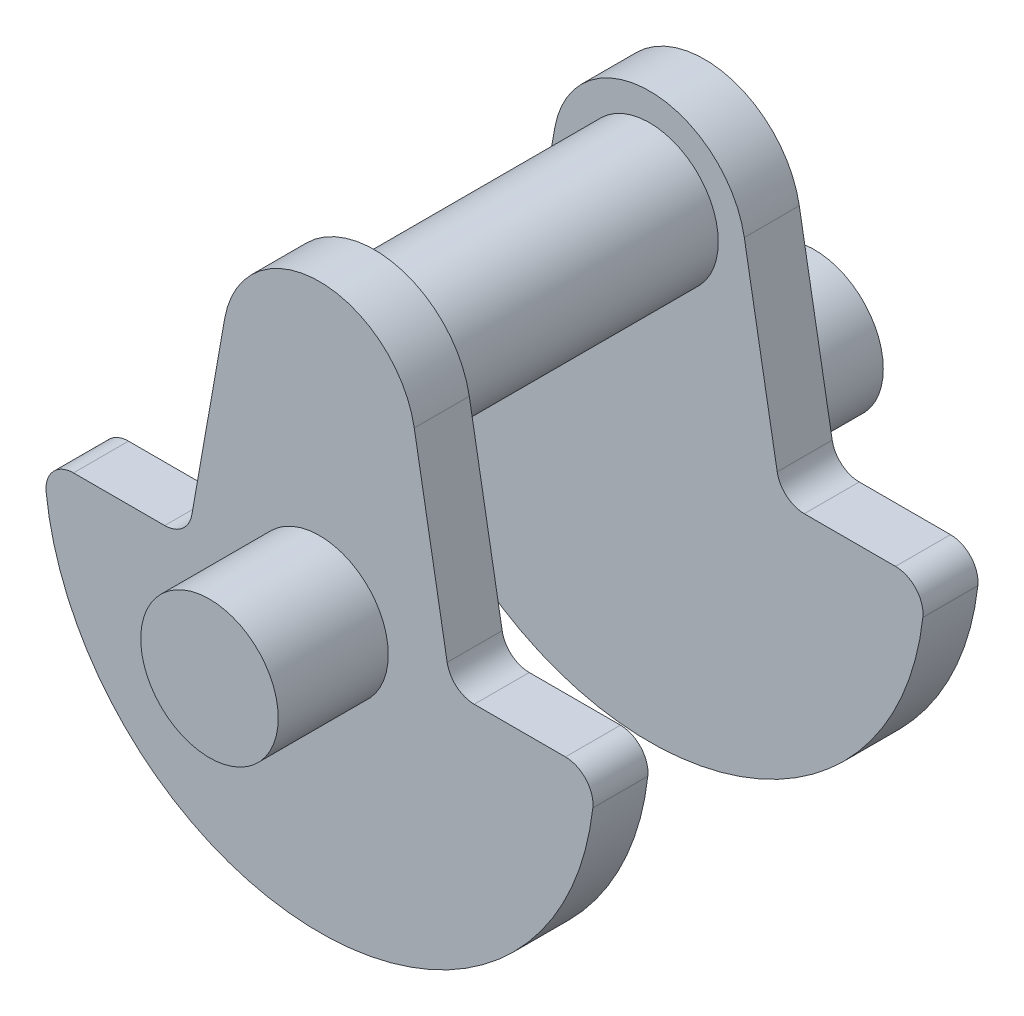
ISO-10303-21;
HEADER;
FILE_DESCRIPTION(('STEP AP214'),'2;1');
FILE_NAME('part.step','',(''),(''),'','','');
FILE_SCHEMA(('AUTOMOTIVE_DESIGN { 1 0 10303 214 1 1 1 1 }'));
ENDSEC;
DATA;
#1=APPLICATION_CONTEXT('core data for automotive mechanical design processes');
#2=APPLICATION_PROTOCOL_DEFINITION('international standard','automotive_design',2000,#1);
#3=PRODUCT_CONTEXT('',#1,'mechanical');
#4=PRODUCT('Part','Part','',(#3));
#5=PRODUCT_RELATED_PRODUCT_CATEGORY('part','',(#4));
#6=PRODUCT_DEFINITION_FORMATION('','',#4);
#7=PRODUCT_DEFINITION_CONTEXT('part definition',#1,'design');
#8=PRODUCT_DEFINITION('design','',#6,#7);
#9=PRODUCT_DEFINITION_SHAPE('','',#8);
#10=(LENGTH_UNIT() NAMED_UNIT(*) SI_UNIT(.MILLI.,.METRE.));
#11=(NAMED_UNIT(*) PLANE_ANGLE_UNIT() SI_UNIT($,.RADIAN.));
#12=(NAMED_UNIT(*) SI_UNIT($,.STERADIAN.) SOLID_ANGLE_UNIT());
#13=UNCERTAINTY_MEASURE_WITH_UNIT(LENGTH_MEASURE(1.E-05),#10,'distance_accuracy_value','');
#14=(GEOMETRIC_REPRESENTATION_CONTEXT(3) GLOBAL_UNCERTAINTY_ASSIGNED_CONTEXT((#13)) GLOBAL_UNIT_ASSIGNED_CONTEXT((#10,
#11,#12)) REPRESENTATION_CONTEXT('',''));
#15=CARTESIAN_POINT('',(0.,0.,0.));
#16=DIRECTION('',(0.,0.,1.));
#17=DIRECTION('',(1.,0.,0.));
#18=AXIS2_PLACEMENT_3D('',#15,#16,#17);
#19=CARTESIAN_POINT('',(-44.7213595499958,-40.,10.));
#20=DIRECTION('',(0.,0.,-1.));
#21=DIRECTION('',(-1.,0.,0.));
#22=AXIS2_PLACEMENT_3D('',#19,#20,#21);
#23=CYLINDRICAL_SURFACE('',#22,4.99999999999999);
#24=CARTESIAN_POINT('',(-44.7213595499958,-40.,0.));
#25=DIRECTION('',(0.,0.,1.));
#26=DIRECTION('',(1.,0.,0.));
#27=AXIS2_PLACEMENT_3D('',#24,#25,#26);
#28=CIRCLE('',#27,4.99999999999999);
#29=CARTESIAN_POINT('',(-44.7213595499958,-35.,0.));
#30=VERTEX_POINT('',#29);
#31=CARTESIAN_POINT('',(-49.6903994999953,-40.5555555555555,0.));
#32=VERTEX_POINT('',#31);
#33=EDGE_CURVE('E159',#30,#32,#28,.T.);
#34=ORIENTED_EDGE('',*,*,#33,.T.);
#35=DIRECTION('',(0.,0.,-1.));
#36=VECTOR('',#35,1.);
#37=CARTESIAN_POINT('',(-49.6903994999953,-40.5555555555555,10.));
#38=LINE('',#37,#36);
#39=CARTESIAN_POINT('',(-49.6903994999953,-40.5555555555555,10.));
#40=VERTEX_POINT('',#39);
#41=EDGE_CURVE('E50',#40,#32,#38,.T.);
#42=ORIENTED_EDGE('',*,*,#41,.F.);
#43=CARTESIAN_POINT('',(-44.7213595499958,-40.,10.));
#44=DIRECTION('',(0.,0.,1.));
#45=DIRECTION('',(1.,0.,0.));
#46=AXIS2_PLACEMENT_3D('',#43,#44,#45);
#47=CIRCLE('',#46,4.99999999999999);
#48=CARTESIAN_POINT('',(-44.7213595499958,-35.,10.));
#49=VERTEX_POINT('',#48);
#50=EDGE_CURVE('E188',#49,#40,#47,.T.);
#51=ORIENTED_EDGE('',*,*,#50,.F.);
#52=DIRECTION('',(0.,0.,-1.));
#53=VECTOR('',#52,1.);
#54=CARTESIAN_POINT('',(-44.7213595499958,-35.,10.));
#55=LINE('',#54,#53);
#56=EDGE_CURVE('E155',#49,#30,#55,.T.);
#57=ORIENTED_EDGE('',*,*,#56,.T.);
#58=EDGE_LOOP('',(#34,#42,#51,#57));
#59=FACE_BOUND('',#58,.T.);
#60=ADVANCED_FACE('F41',(#59),#23,.T.);
#61=CARTESIAN_POINT('',(0.,-35.,10.));
#62=DIRECTION('',(0.,0.,-1.));
#63=DIRECTION('',(-1.,0.,0.));
#64=AXIS2_PLACEMENT_3D('',#61,#62,#63);
#65=CYLINDRICAL_SURFACE('',#64,50.);
#66=CARTESIAN_POINT('',(0.,-35.,0.));
#67=DIRECTION('',(0.,0.,1.));
#68=DIRECTION('',(1.,0.,0.));
#69=AXIS2_PLACEMENT_3D('',#66,#67,#68);
#70=CIRCLE('',#69,50.);
#71=CARTESIAN_POINT('',(49.6903994999953,-40.5555555555556,0.));
#72=VERTEX_POINT('',#71);
#73=EDGE_CURVE('E163',#32,#72,#70,.T.);
#74=ORIENTED_EDGE('',*,*,#73,.T.);
#75=DIRECTION('',(0.,0.,-1.));
#76=VECTOR('',#75,1.);
#77=CARTESIAN_POINT('',(49.6903994999953,-40.5555555555556,10.));
#78=LINE('',#77,#76);
#79=CARTESIAN_POINT('',(49.6903994999953,-40.5555555555556,10.));
#80=VERTEX_POINT('',#79);
#81=EDGE_CURVE('E211',#80,#72,#78,.T.);
#82=ORIENTED_EDGE('',*,*,#81,.F.);
#83=CARTESIAN_POINT('',(0.,-35.,10.));
#84=DIRECTION('',(0.,0.,1.));
#85=DIRECTION('',(1.,0.,0.));
#86=AXIS2_PLACEMENT_3D('',#83,#84,#85);
#87=CIRCLE('',#86,50.);
#88=EDGE_CURVE('E109',#40,#80,#87,.T.);
#89=ORIENTED_EDGE('',*,*,#88,.F.);
#90=ORIENTED_EDGE('',*,*,#41,.T.);
#91=EDGE_LOOP('',(#74,#82,#89,#90));
#92=FACE_BOUND('',#91,.T.);
#93=ADVANCED_FACE('F216',(#92),#65,.T.);
#94=CARTESIAN_POINT('',(44.7213595499958,-40.,10.));
#95=DIRECTION('',(0.,0.,-1.));
#96=DIRECTION('',(-1.,0.,0.));
#97=AXIS2_PLACEMENT_3D('',#94,#95,#96);
#98=CYLINDRICAL_SURFACE('',#97,4.99999999999999);
#99=CARTESIAN_POINT('',(44.7213595499958,-40.,0.));
#100=DIRECTION('',(0.,0.,1.));
#101=DIRECTION('',(-1.,0.,0.));
#102=AXIS2_PLACEMENT_3D('',#99,#100,#101);
#103=CIRCLE('',#102,4.99999999999999);
#104=CARTESIAN_POINT('',(44.7213595499958,-35.,0.));
#105=VERTEX_POINT('',#104);
#106=EDGE_CURVE('E167',#72,#105,#103,.T.);
#107=ORIENTED_EDGE('',*,*,#106,.T.);
#108=DIRECTION('',(0.,0.,-1.));
#109=VECTOR('',#108,1.);
#110=CARTESIAN_POINT('',(44.7213595499958,-35.,10.));
#111=LINE('',#110,#109);
#112=CARTESIAN_POINT('',(44.7213595499958,-35.,10.));
#113=VERTEX_POINT('',#112);
#114=EDGE_CURVE('E207',#113,#105,#111,.T.);
#115=ORIENTED_EDGE('',*,*,#114,.F.);
#116=CARTESIAN_POINT('',(44.7213595499958,-40.,10.));
#117=DIRECTION('',(0.,0.,1.));
#118=DIRECTION('',(-1.,0.,0.));
#119=AXIS2_PLACEMENT_3D('',#116,#117,#118);
#120=CIRCLE('',#119,4.99999999999999);
#121=EDGE_CURVE('E237',#80,#113,#120,.T.);
#122=ORIENTED_EDGE('',*,*,#121,.F.);
#123=ORIENTED_EDGE('',*,*,#81,.T.);
#124=EDGE_LOOP('',(#107,#115,#122,#123));
#125=FACE_BOUND('',#124,.T.);
#126=ADVANCED_FACE('F227',(#125),#98,.T.);
#127=CARTESIAN_POINT('',(28.1369081886833,-35.,10.));
#128=DIRECTION('',(0.,-1.,0.));
#129=DIRECTION('',(0.,0.,-1.));
#130=AXIS2_PLACEMENT_3D('',#127,#128,#129);
#131=PLANE('',#130);
#132=DIRECTION('',(-1.,0.,0.));
#133=VECTOR('',#132,1.);
#134=CARTESIAN_POINT('',(28.1369081886833,-35.,0.));
#135=LINE('',#134,#133);
#136=CARTESIAN_POINT('',(28.1369081886833,-35.,0.));
#137=VERTEX_POINT('',#136);
#138=EDGE_CURVE('E170',#105,#137,#135,.T.);
#139=ORIENTED_EDGE('',*,*,#138,.T.);
#140=DIRECTION('',(0.,0.,-1.));
#141=VECTOR('',#140,1.);
#142=CARTESIAN_POINT('',(28.1369081886833,-35.,10.));
#143=LINE('',#142,#141);
#144=CARTESIAN_POINT('',(28.1369081886833,-35.,10.));
#145=VERTEX_POINT('',#144);
#146=EDGE_CURVE('E203',#145,#137,#143,.T.);
#147=ORIENTED_EDGE('',*,*,#146,.F.);
#148=DIRECTION('',(-1.,0.,0.));
#149=VECTOR('',#148,1.);
#150=CARTESIAN_POINT('',(28.1369081886833,-35.,10.));
#151=LINE('',#150,#149);
#152=EDGE_CURVE('E233',#113,#145,#151,.T.);
#153=ORIENTED_EDGE('',*,*,#152,.F.);
#154=ORIENTED_EDGE('',*,*,#114,.T.);
#155=EDGE_LOOP('',(#139,#147,#153,#154));
#156=FACE_BOUND('',#155,.T.);
#157=ADVANCED_FACE('F231',(#156),#131,.F.);
#158=CARTESIAN_POINT('',(28.1369081886832,-30.,10.));
#159=DIRECTION('',(0.,0.,-1.));
#160=DIRECTION('',(-1.,0.,0.));
#161=AXIS2_PLACEMENT_3D('',#158,#159,#160);
#162=CYLINDRICAL_SURFACE('',#161,5.);
#163=CARTESIAN_POINT('',(28.1369081886832,-30.,0.));
#164=DIRECTION('',(0.,0.,-1.));
#165=DIRECTION('',(1.,0.,0.));
#166=AXIS2_PLACEMENT_3D('',#163,#164,#165);
#167=CIRCLE('',#166,5.);
#168=CARTESIAN_POINT('',(23.2128694236222,-30.8682408883346,0.));
#169=VERTEX_POINT('',#168);
#170=EDGE_CURVE('E173',#137,#169,#167,.T.);
#171=ORIENTED_EDGE('',*,*,#170,.T.);
#172=DIRECTION('',(0.,0.,-1.));
#173=VECTOR('',#172,1.);
#174=CARTESIAN_POINT('',(23.2128694236222,-30.8682408883346,10.));
#175=LINE('',#174,#173);
#176=CARTESIAN_POINT('',(23.2128694236222,-30.8682408883346,10.));
#177=VERTEX_POINT('',#176);
#178=EDGE_CURVE('E199',#177,#169,#175,.T.);
#179=ORIENTED_EDGE('',*,*,#178,.F.);
#180=CARTESIAN_POINT('',(28.1369081886832,-30.,10.));
#181=DIRECTION('',(0.,0.,-1.));
#182=DIRECTION('',(1.,0.,0.));
#183=AXIS2_PLACEMENT_3D('',#180,#181,#182);
#184=CIRCLE('',#183,5.);
#185=EDGE_CURVE('E236',#145,#177,#184,.T.);
#186=ORIENTED_EDGE('',*,*,#185,.F.);
#187=ORIENTED_EDGE('',*,*,#146,.T.);
#188=EDGE_LOOP('',(#171,#179,#186,#187));
#189=FACE_BOUND('',#188,.T.);
#190=ADVANCED_FACE('F258',(#189),#162,.F.);
#191=CARTESIAN_POINT('',(17.2341356777136,3.03884310917129,10.));
#192=DIRECTION('',(-0.984807753012208,-0.173648177666931,0.));
#193=DIRECTION('',(0.173648177666931,-0.984807753012208,0.));
#194=AXIS2_PLACEMENT_3D('',#191,#192,#193);
#195=PLANE('',#194);
#196=DIRECTION('',(-0.173648177666931,0.984807753012208,0.));
#197=VECTOR('',#196,1.);
#198=CARTESIAN_POINT('',(17.2341356777136,3.03884310917129,0.));
#199=LINE('',#198,#197);
#200=CARTESIAN_POINT('',(17.2341356777136,3.03884310917129,0.));
#201=VERTEX_POINT('',#200);
#202=EDGE_CURVE('E176',#169,#201,#199,.T.);
#203=ORIENTED_EDGE('',*,*,#202,.T.);
#204=DIRECTION('',(0.,0.,-1.));
#205=VECTOR('',#204,1.);
#206=CARTESIAN_POINT('',(17.2341356777136,3.03884310917129,10.));
#207=LINE('',#206,#205);
#208=CARTESIAN_POINT('',(17.2341356777136,3.03884310917129,10.));
#209=VERTEX_POINT('',#208);
#210=EDGE_CURVE('E195',#209,#201,#207,.T.);
#211=ORIENTED_EDGE('',*,*,#210,.F.);
#212=DIRECTION('',(-0.173648177666931,0.984807753012208,0.));
#213=VECTOR('',#212,1.);
#214=CARTESIAN_POINT('',(17.2341356777136,3.03884310917129,10.));
#215=LINE('',#214,#213);
#216=EDGE_CURVE('E241',#177,#209,#215,.T.);
#217=ORIENTED_EDGE('',*,*,#216,.F.);
#218=ORIENTED_EDGE('',*,*,#178,.T.);
#219=EDGE_LOOP('',(#203,#211,#217,#218));
#220=FACE_BOUND('',#219,.T.);
#221=ADVANCED_FACE('F252',(#220),#195,.F.);
#222=CARTESIAN_POINT('',(0.,0.,10.));
#223=DIRECTION('',(0.,0.,-1.));
#224=DIRECTION('',(-1.,0.,0.));
#225=AXIS2_PLACEMENT_3D('',#222,#223,#224);
#226=CYLINDRICAL_SURFACE('',#225,17.5);
#227=CARTESIAN_POINT('',(0.,0.,0.));
#228=DIRECTION('',(0.,0.,1.));
#229=DIRECTION('',(1.,0.,0.));
#230=AXIS2_PLACEMENT_3D('',#227,#228,#229);
#231=CIRCLE('',#230,17.5);
#232=CARTESIAN_POINT('',(-17.2341356777136,3.03884310917129,0.));
#233=VERTEX_POINT('',#232);
#234=EDGE_CURVE('E179',#201,#233,#231,.T.);
#235=ORIENTED_EDGE('',*,*,#234,.T.);
#236=DIRECTION('',(0.,0.,-1.));
#237=VECTOR('',#236,1.);
#238=CARTESIAN_POINT('',(-17.2341356777136,3.03884310917129,10.));
#239=LINE('',#238,#237);
#240=CARTESIAN_POINT('',(-17.2341356777136,3.03884310917129,10.));
#241=VERTEX_POINT('',#240);
#242=EDGE_CURVE('E148',#241,#233,#239,.T.);
#243=ORIENTED_EDGE('',*,*,#242,.F.);
#244=CARTESIAN_POINT('',(0.,0.,10.));
#245=DIRECTION('',(0.,0.,1.));
#246=DIRECTION('',(1.,0.,0.));
#247=AXIS2_PLACEMENT_3D('',#244,#245,#246);
#248=CIRCLE('',#247,17.5);
#249=EDGE_CURVE('E137',#209,#241,#248,.T.);
#250=ORIENTED_EDGE('',*,*,#249,.F.);
#251=ORIENTED_EDGE('',*,*,#210,.T.);
#252=EDGE_LOOP('',(#235,#243,#250,#251));
#253=FACE_BOUND('',#252,.T.);
#254=ADVANCED_FACE('F256',(#253),#226,.T.);
#255=CARTESIAN_POINT('',(-17.2341356777136,3.03884310917129,10.));
#256=DIRECTION('',(0.984807753012208,-0.17364817766693,0.));
#257=DIRECTION('',(0.17364817766693,0.984807753012208,0.));
#258=AXIS2_PLACEMENT_3D('',#255,#256,#257);
#259=PLANE('',#258);
#260=DIRECTION('',(-0.173648177666931,-0.984807753012208,0.));
#261=VECTOR('',#260,1.);
#262=CARTESIAN_POINT('',(-17.2341356777136,3.03884310917129,0.));
#263=LINE('',#262,#261);
#264=CARTESIAN_POINT('',(-23.2128694236222,-30.8682408883346,0.));
#265=VERTEX_POINT('',#264);
#266=EDGE_CURVE('E146',#233,#265,#263,.T.);
#267=ORIENTED_EDGE('',*,*,#266,.T.);
#268=DIRECTION('',(0.,0.,-1.));
#269=VECTOR('',#268,1.);
#270=CARTESIAN_POINT('',(-23.2128694236222,-30.8682408883346,10.));
#271=LINE('',#270,#269);
#272=CARTESIAN_POINT('',(-23.2128694236222,-30.8682408883346,10.));
#273=VERTEX_POINT('',#272);
#274=EDGE_CURVE('E143',#273,#265,#271,.T.);
#275=ORIENTED_EDGE('',*,*,#274,.F.);
#276=DIRECTION('',(-0.173648177666931,-0.984807753012208,0.));
#277=VECTOR('',#276,1.);
#278=CARTESIAN_POINT('',(-17.2341356777136,3.03884310917129,10.));
#279=LINE('',#278,#277);
#280=EDGE_CURVE('E131',#241,#273,#279,.T.);
#281=ORIENTED_EDGE('',*,*,#280,.F.);
#282=ORIENTED_EDGE('',*,*,#242,.T.);
#283=EDGE_LOOP('',(#267,#275,#281,#282));
#284=FACE_BOUND('',#283,.T.);
#285=ADVANCED_FACE('F144',(#284),#259,.F.);
#286=CARTESIAN_POINT('',(-28.1369081886832,-30.,10.));
#287=DIRECTION('',(0.,0.,-1.));
#288=DIRECTION('',(-1.,0.,0.));
#289=AXIS2_PLACEMENT_3D('',#286,#287,#288);
#290=CYLINDRICAL_SURFACE('',#289,5.);
#291=CARTESIAN_POINT('',(-28.1369081886832,-30.,0.));
#292=DIRECTION('',(0.,0.,-1.));
#293=DIRECTION('',(-1.,0.,0.));
#294=AXIS2_PLACEMENT_3D('',#291,#292,#293);
#295=CIRCLE('',#294,5.);
#296=CARTESIAN_POINT('',(-28.1369081886832,-35.,0.));
#297=VERTEX_POINT('',#296);
#298=EDGE_CURVE('E94',#265,#297,#295,.T.);
#299=ORIENTED_EDGE('',*,*,#298,.T.);
#300=DIRECTION('',(0.,0.,-1.));
#301=VECTOR('',#300,1.);
#302=CARTESIAN_POINT('',(-28.1369081886832,-35.,10.));
#303=LINE('',#302,#301);
#304=CARTESIAN_POINT('',(-28.1369081886832,-35.,10.));
#305=VERTEX_POINT('',#304);
#306=EDGE_CURVE('E149',#305,#297,#303,.T.);
#307=ORIENTED_EDGE('',*,*,#306,.F.);
#308=CARTESIAN_POINT('',(-28.1369081886832,-30.,10.));
#309=DIRECTION('',(0.,0.,-1.));
#310=DIRECTION('',(-1.,0.,0.));
#311=AXIS2_PLACEMENT_3D('',#308,#309,#310);
#312=CIRCLE('',#311,5.);
#313=EDGE_CURVE('E135',#273,#305,#312,.T.);
#314=ORIENTED_EDGE('',*,*,#313,.F.);
#315=ORIENTED_EDGE('',*,*,#274,.T.);
#316=EDGE_LOOP('',(#299,#307,#314,#315));
#317=FACE_BOUND('',#316,.T.);
#318=ADVANCED_FACE('F151',(#317),#290,.F.);
#319=CARTESIAN_POINT('',(-44.7213595499958,-35.,10.));
#320=DIRECTION('',(0.,-1.,0.));
#321=DIRECTION('',(0.,0.,-1.));
#322=AXIS2_PLACEMENT_3D('',#319,#320,#321);
#323=PLANE('',#322);
#324=DIRECTION('',(-1.,0.,0.));
#325=VECTOR('',#324,1.);
#326=CARTESIAN_POINT('',(-44.7213595499958,-35.,0.));
#327=LINE('',#326,#325);
#328=EDGE_CURVE('E100',#297,#30,#327,.T.);
#329=ORIENTED_EDGE('',*,*,#328,.T.);
#330=ORIENTED_EDGE('',*,*,#56,.F.);
#331=DIRECTION('',(-1.,0.,0.));
#332=VECTOR('',#331,1.);
#333=CARTESIAN_POINT('',(-44.7213595499958,-35.,10.));
#334=LINE('',#333,#332);
#335=EDGE_CURVE('E58',#305,#49,#334,.T.);
#336=ORIENTED_EDGE('',*,*,#335,.F.);
#337=ORIENTED_EDGE('',*,*,#306,.T.);
#338=EDGE_LOOP('',(#329,#330,#336,#337));
#339=FACE_BOUND('',#338,.T.);
#340=ADVANCED_FACE('F318',(#339),#323,.F.);
#341=CARTESIAN_POINT('',(-44.7213595499958,-40.,10.));
#342=DIRECTION('',(0.,0.,1.));
#343=DIRECTION('',(1.,0.,0.));
#344=AXIS2_PLACEMENT_3D('',#341,#342,#343);
#345=PLANE('',#344);
#346=CARTESIAN_POINT('',(0.,-35.,10.));
#347=DIRECTION('',(0.,0.,1.));
#348=DIRECTION('',(1.,0.,0.));
#349=AXIS2_PLACEMENT_3D('',#346,#347,#348);
#350=CIRCLE('',#349,12.5);
#351=CARTESIAN_POINT('',(12.5,-35.,10.));
#352=VERTEX_POINT('',#351);
#353=EDGE_CURVE('E647',#352,#352,#350,.T.);
#354=ORIENTED_EDGE('',*,*,#353,.F.);
#355=EDGE_LOOP('',(#354));
#356=FACE_BOUND('',#355,.T.);
#357=ORIENTED_EDGE('',*,*,#50,.T.);
#358=ORIENTED_EDGE('',*,*,#88,.T.);
#359=ORIENTED_EDGE('',*,*,#121,.T.);
#360=ORIENTED_EDGE('',*,*,#152,.T.);
#361=ORIENTED_EDGE('',*,*,#185,.T.);
#362=ORIENTED_EDGE('',*,*,#216,.T.);
#363=ORIENTED_EDGE('',*,*,#249,.T.);
#364=ORIENTED_EDGE('',*,*,#280,.T.);
#365=ORIENTED_EDGE('',*,*,#313,.T.);
#366=ORIENTED_EDGE('',*,*,#335,.T.);
#367=EDGE_LOOP('',(#357,#358,#359,#360,#361,#362,#363,#364,#365,#366));
#368=FACE_BOUND('',#367,.T.);
#369=ADVANCED_FACE('F133',(#356,#368),#345,.T.);
#370=CARTESIAN_POINT('',(-44.7213595499958,-40.,0.));
#371=DIRECTION('',(0.,0.,1.));
#372=DIRECTION('',(1.,0.,0.));
#373=AXIS2_PLACEMENT_3D('',#370,#371,#372);
#374=PLANE('',#373);
#375=CARTESIAN_POINT('',(0.,0.,0.));
#376=DIRECTION('',(0.,0.,1.));
#377=DIRECTION('',(1.,0.,0.));
#378=AXIS2_PLACEMENT_3D('',#375,#376,#377);
#379=CIRCLE('',#378,12.5);
#380=CARTESIAN_POINT('',(12.5,0.,0.));
#381=VERTEX_POINT('',#380);
#382=EDGE_CURVE('E11',#381,#381,#379,.F.);
#383=ORIENTED_EDGE('',*,*,#382,.F.);
#384=EDGE_LOOP('',(#383));
#385=FACE_BOUND('',#384,.T.);
#386=ORIENTED_EDGE('',*,*,#33,.F.);
#387=ORIENTED_EDGE('',*,*,#328,.F.);
#388=ORIENTED_EDGE('',*,*,#298,.F.);
#389=ORIENTED_EDGE('',*,*,#266,.F.);
#390=ORIENTED_EDGE('',*,*,#234,.F.);
#391=ORIENTED_EDGE('',*,*,#202,.F.);
#392=ORIENTED_EDGE('',*,*,#170,.F.);
#393=ORIENTED_EDGE('',*,*,#138,.F.);
#394=ORIENTED_EDGE('',*,*,#106,.F.);
#395=ORIENTED_EDGE('',*,*,#73,.F.);
#396=EDGE_LOOP('',(#386,#387,#388,#389,#390,#391,#392,#393,#394,#395));
#397=FACE_BOUND('',#396,.T.);
#398=ADVANCED_FACE('F221',(#385,#397),#374,.F.);
#399=CARTESIAN_POINT('',(0.,-35.,30.));
#400=DIRECTION('',(0.,0.,-1.));
#401=DIRECTION('',(-1.,0.,0.));
#402=AXIS2_PLACEMENT_3D('',#399,#400,#401);
#403=CYLINDRICAL_SURFACE('',#402,12.5);
#404=CARTESIAN_POINT('',(0.,-35.,30.));
#405=DIRECTION('',(0.,0.,1.));
#406=DIRECTION('',(1.,0.,0.));
#407=AXIS2_PLACEMENT_3D('',#404,#405,#406);
#408=CIRCLE('',#407,12.5);
#409=CARTESIAN_POINT('',(12.5,-35.,30.));
#410=VERTEX_POINT('',#409);
#411=EDGE_CURVE('E164',#410,#410,#408,.T.);
#412=ORIENTED_EDGE('',*,*,#411,.F.);
#413=EDGE_LOOP('',(#412));
#414=FACE_BOUND('',#413,.T.);
#415=ORIENTED_EDGE('',*,*,#353,.T.);
#416=EDGE_LOOP('',(#415));
#417=FACE_BOUND('',#416,.T.);
#418=ADVANCED_FACE('F338',(#414,#417),#403,.T.);
#419=CARTESIAN_POINT('',(0.,-35.,30.));
#420=DIRECTION('',(0.,0.,1.));
#421=DIRECTION('',(1.,0.,0.));
#422=AXIS2_PLACEMENT_3D('',#419,#420,#421);
#423=PLANE('',#422);
#424=ORIENTED_EDGE('',*,*,#411,.T.);
#425=EDGE_LOOP('',(#424));
#426=FACE_BOUND('',#425,.T.);
#427=ADVANCED_FACE('F342',(#426),#423,.T.);
#428=CARTESIAN_POINT('',(0.,0.,-25.));
#429=DIRECTION('',(0.,0.,1.));
#430=DIRECTION('',(1.,0.,0.));
#431=AXIS2_PLACEMENT_3D('',#428,#429,#430);
#432=CYLINDRICAL_SURFACE('',#431,12.5);
#433=ORIENTED_EDGE('',*,*,#382,.T.);
#434=EDGE_LOOP('',(#433));
#435=FACE_BOUND('',#434,.T.);
#436=CARTESIAN_POINT('',(0.,0.,-50.));
#437=DIRECTION('',(0.,0.,1.));
#438=DIRECTION('',(1.,0.,0.));
#439=AXIS2_PLACEMENT_3D('',#436,#437,#438);
#440=CIRCLE('',#439,12.5);
#441=CARTESIAN_POINT('',(12.5,0.,-50.));
#442=VERTEX_POINT('',#441);
#443=EDGE_CURVE('E643',#442,#442,#440,.F.);
#444=ORIENTED_EDGE('',*,*,#443,.F.);
#445=EDGE_LOOP('',(#444));
#446=FACE_BOUND('',#445,.T.);
#447=ADVANCED_FACE('F351',(#435,#446),#432,.T.);
#448=CARTESIAN_POINT('',(-44.7213595499958,-40.,-60.));
#449=DIRECTION('',(0.,0.,1.));
#450=DIRECTION('',(-1.,0.,0.));
#451=AXIS2_PLACEMENT_3D('',#448,#449,#450);
#452=CYLINDRICAL_SURFACE('',#451,4.99999999999999);
#453=CARTESIAN_POINT('',(-44.7213595499958,-40.,-50.));
#454=DIRECTION('',(0.,0.,1.));
#455=DIRECTION('',(1.,0.,0.));
#456=AXIS2_PLACEMENT_3D('',#453,#454,#455);
#457=CIRCLE('',#456,4.99999999999999);
#458=CARTESIAN_POINT('',(-44.7213595499958,-35.,-50.));
#459=VERTEX_POINT('',#458);
#460=CARTESIAN_POINT('',(-49.6903994999953,-40.5555555555555,-50.));
#461=VERTEX_POINT('',#460);
#462=EDGE_CURVE('E517',#459,#461,#457,.T.);
#463=ORIENTED_EDGE('',*,*,#462,.F.);
#464=DIRECTION('',(0.,0.,1.));
#465=VECTOR('',#464,1.);
#466=CARTESIAN_POINT('',(-44.7213595499958,-35.,-60.));
#467=LINE('',#466,#465);
#468=CARTESIAN_POINT('',(-44.7213595499958,-35.,-60.));
#469=VERTEX_POINT('',#468);
#470=EDGE_CURVE('E568',#469,#459,#467,.T.);
#471=ORIENTED_EDGE('',*,*,#470,.F.);
#472=CARTESIAN_POINT('',(-44.7213595499958,-40.,-60.));
#473=DIRECTION('',(0.,0.,1.));
#474=DIRECTION('',(1.,0.,0.));
#475=AXIS2_PLACEMENT_3D('',#472,#473,#474);
#476=CIRCLE('',#475,4.99999999999999);
#477=CARTESIAN_POINT('',(-49.6903994999953,-40.5555555555555,-60.));
#478=VERTEX_POINT('',#477);
#479=EDGE_CURVE('E528',#469,#478,#476,.T.);
#480=ORIENTED_EDGE('',*,*,#479,.T.);
#481=DIRECTION('',(0.,0.,1.));
#482=VECTOR('',#481,1.);
#483=CARTESIAN_POINT('',(-49.6903994999953,-40.5555555555555,-60.));
#484=LINE('',#483,#482);
#485=EDGE_CURVE('E639',#478,#461,#484,.T.);
#486=ORIENTED_EDGE('',*,*,#485,.T.);
#487=EDGE_LOOP('',(#463,#471,#480,#486));
#488=FACE_BOUND('',#487,.T.);
#489=ADVANCED_FACE('F369',(#488),#452,.T.);
#490=CARTESIAN_POINT('',(0.,-35.,-60.));
#491=DIRECTION('',(0.,0.,1.));
#492=DIRECTION('',(-1.,0.,0.));
#493=AXIS2_PLACEMENT_3D('',#490,#491,#492);
#494=CYLINDRICAL_SURFACE('',#493,50.);
#495=CARTESIAN_POINT('',(0.,-35.,-50.));
#496=DIRECTION('',(0.,0.,1.));
#497=DIRECTION('',(1.,0.,0.));
#498=AXIS2_PLACEMENT_3D('',#495,#496,#497);
#499=CIRCLE('',#498,50.);
#500=CARTESIAN_POINT('',(49.6903994999953,-40.5555555555556,-50.));
#501=VERTEX_POINT('',#500);
#502=EDGE_CURVE('E523',#461,#501,#499,.T.);
#503=ORIENTED_EDGE('',*,*,#502,.F.);
#504=ORIENTED_EDGE('',*,*,#485,.F.);
#505=CARTESIAN_POINT('',(0.,-35.,-60.));
#506=DIRECTION('',(0.,0.,1.));
#507=DIRECTION('',(1.,0.,0.));
#508=AXIS2_PLACEMENT_3D('',#505,#506,#507);
#509=CIRCLE('',#508,50.);
#510=CARTESIAN_POINT('',(49.6903994999953,-40.5555555555556,-60.));
#511=VERTEX_POINT('',#510);
#512=EDGE_CURVE('E532',#478,#511,#509,.T.);
#513=ORIENTED_EDGE('',*,*,#512,.T.);
#514=DIRECTION('',(0.,0.,1.));
#515=VECTOR('',#514,1.);
#516=CARTESIAN_POINT('',(49.6903994999953,-40.5555555555556,-60.));
#517=LINE('',#516,#515);
#518=EDGE_CURVE('E635',#511,#501,#517,.T.);
#519=ORIENTED_EDGE('',*,*,#518,.T.);
#520=EDGE_LOOP('',(#503,#504,#513,#519));
#521=FACE_BOUND('',#520,.T.);
#522=ADVANCED_FACE('F379',(#521),#494,.T.);
#523=CARTESIAN_POINT('',(44.7213595499958,-40.,-60.));
#524=DIRECTION('',(0.,0.,1.));
#525=DIRECTION('',(-1.,0.,0.));
#526=AXIS2_PLACEMENT_3D('',#523,#524,#525);
#527=CYLINDRICAL_SURFACE('',#526,4.99999999999999);
#528=CARTESIAN_POINT('',(44.7213595499958,-40.,-50.));
#529=DIRECTION('',(0.,0.,1.));
#530=DIRECTION('',(-1.,0.,0.));
#531=AXIS2_PLACEMENT_3D('',#528,#529,#530);
#532=CIRCLE('',#531,4.99999999999999);
#533=CARTESIAN_POINT('',(44.7213595499958,-35.,-50.));
#534=VERTEX_POINT('',#533);
#535=EDGE_CURVE('E573',#501,#534,#532,.T.);
#536=ORIENTED_EDGE('',*,*,#535,.F.);
#537=ORIENTED_EDGE('',*,*,#518,.F.);
#538=CARTESIAN_POINT('',(44.7213595499958,-40.,-60.));
#539=DIRECTION('',(0.,0.,1.));
#540=DIRECTION('',(-1.,0.,0.));
#541=AXIS2_PLACEMENT_3D('',#538,#539,#540);
#542=CIRCLE('',#541,4.99999999999999);
#543=CARTESIAN_POINT('',(44.7213595499958,-35.,-60.));
#544=VERTEX_POINT('',#543);
#545=EDGE_CURVE('E537',#511,#544,#542,.T.);
#546=ORIENTED_EDGE('',*,*,#545,.T.);
#547=DIRECTION('',(0.,0.,1.));
#548=VECTOR('',#547,1.);
#549=CARTESIAN_POINT('',(44.7213595499958,-35.,-60.));
#550=LINE('',#549,#548);
#551=EDGE_CURVE('E631',#544,#534,#550,.T.);
#552=ORIENTED_EDGE('',*,*,#551,.T.);
#553=EDGE_LOOP('',(#536,#537,#546,#552));
#554=FACE_BOUND('',#553,.T.);
#555=ADVANCED_FACE('F389',(#554),#527,.T.);
#556=CARTESIAN_POINT('',(28.1369081886833,-35.,-60.));
#557=DIRECTION('',(0.,-1.,0.));
#558=DIRECTION('',(0.,0.,1.));
#559=AXIS2_PLACEMENT_3D('',#556,#557,#558);
#560=PLANE('',#559);
#561=DIRECTION('',(-1.,0.,0.));
#562=VECTOR('',#561,1.);
#563=CARTESIAN_POINT('',(28.1369081886833,-35.,-50.));
#564=LINE('',#563,#562);
#565=CARTESIAN_POINT('',(28.1369081886833,-35.,-50.));
#566=VERTEX_POINT('',#565);
#567=EDGE_CURVE('E577',#534,#566,#564,.T.);
#568=ORIENTED_EDGE('',*,*,#567,.F.);
#569=ORIENTED_EDGE('',*,*,#551,.F.);
#570=DIRECTION('',(-1.,0.,0.));
#571=VECTOR('',#570,1.);
#572=CARTESIAN_POINT('',(28.1369081886833,-35.,-60.));
#573=LINE('',#572,#571);
#574=CARTESIAN_POINT('',(28.1369081886833,-35.,-60.));
#575=VERTEX_POINT('',#574);
#576=EDGE_CURVE('E541',#544,#575,#573,.T.);
#577=ORIENTED_EDGE('',*,*,#576,.T.);
#578=DIRECTION('',(0.,0.,1.));
#579=VECTOR('',#578,1.);
#580=CARTESIAN_POINT('',(28.1369081886833,-35.,-60.));
#581=LINE('',#580,#579);
#582=EDGE_CURVE('E627',#575,#566,#581,.T.);
#583=ORIENTED_EDGE('',*,*,#582,.T.);
#584=EDGE_LOOP('',(#568,#569,#577,#583));
#585=FACE_BOUND('',#584,.T.);
#586=ADVANCED_FACE('F399',(#585),#560,.F.);
#587=CARTESIAN_POINT('',(28.1369081886832,-30.,-60.));
#588=DIRECTION('',(0.,0.,1.));
#589=DIRECTION('',(-1.,0.,0.));
#590=AXIS2_PLACEMENT_3D('',#587,#588,#589);
#591=CYLINDRICAL_SURFACE('',#590,5.);
#592=CARTESIAN_POINT('',(28.1369081886832,-30.,-50.));
#593=DIRECTION('',(0.,0.,-1.));
#594=DIRECTION('',(1.,0.,0.));
#595=AXIS2_PLACEMENT_3D('',#592,#593,#594);
#596=CIRCLE('',#595,5.);
#597=CARTESIAN_POINT('',(23.2128694236222,-30.8682408883346,-50.));
#598=VERTEX_POINT('',#597);
#599=EDGE_CURVE('E581',#566,#598,#596,.T.);
#600=ORIENTED_EDGE('',*,*,#599,.F.);
#601=ORIENTED_EDGE('',*,*,#582,.F.);
#602=CARTESIAN_POINT('',(28.1369081886832,-30.,-60.));
#603=DIRECTION('',(0.,0.,-1.));
#604=DIRECTION('',(1.,0.,0.));
#605=AXIS2_PLACEMENT_3D('',#602,#603,#604);
#606=CIRCLE('',#605,5.);
#607=CARTESIAN_POINT('',(23.2128694236222,-30.8682408883346,-60.));
#608=VERTEX_POINT('',#607);
#609=EDGE_CURVE('E545',#575,#608,#606,.T.);
#610=ORIENTED_EDGE('',*,*,#609,.T.);
#611=DIRECTION('',(0.,0.,1.));
#612=VECTOR('',#611,1.);
#613=CARTESIAN_POINT('',(23.2128694236222,-30.8682408883346,-60.));
#614=LINE('',#613,#612);
#615=EDGE_CURVE('E623',#608,#598,#614,.T.);
#616=ORIENTED_EDGE('',*,*,#615,.T.);
#617=EDGE_LOOP('',(#600,#601,#610,#616));
#618=FACE_BOUND('',#617,.T.);
#619=ADVANCED_FACE('F409',(#618),#591,.F.);
#620=CARTESIAN_POINT('',(17.2341356777136,3.03884310917129,-60.));
#621=DIRECTION('',(-0.984807753012208,-0.173648177666931,0.));
#622=DIRECTION('',(0.173648177666931,-0.984807753012208,0.));
#623=AXIS2_PLACEMENT_3D('',#620,#621,#622);
#624=PLANE('',#623);
#625=DIRECTION('',(-0.173648177666931,0.984807753012208,0.));
#626=VECTOR('',#625,1.);
#627=CARTESIAN_POINT('',(17.2341356777136,3.03884310917129,-50.));
#628=LINE('',#627,#626);
#629=CARTESIAN_POINT('',(17.2341356777136,3.03884310917129,-50.));
#630=VERTEX_POINT('',#629);
#631=EDGE_CURVE('E585',#598,#630,#628,.T.);
#632=ORIENTED_EDGE('',*,*,#631,.F.);
#633=ORIENTED_EDGE('',*,*,#615,.F.);
#634=DIRECTION('',(-0.173648177666931,0.984807753012208,0.));
#635=VECTOR('',#634,1.);
#636=CARTESIAN_POINT('',(17.2341356777136,3.03884310917129,-60.));
#637=LINE('',#636,#635);
#638=CARTESIAN_POINT('',(17.2341356777136,3.03884310917129,-60.));
#639=VERTEX_POINT('',#638);
#640=EDGE_CURVE('E549',#608,#639,#637,.T.);
#641=ORIENTED_EDGE('',*,*,#640,.T.);
#642=DIRECTION('',(0.,0.,1.));
#643=VECTOR('',#642,1.);
#644=CARTESIAN_POINT('',(17.2341356777136,3.03884310917129,-60.));
#645=LINE('',#644,#643);
#646=EDGE_CURVE('E619',#639,#630,#645,.T.);
#647=ORIENTED_EDGE('',*,*,#646,.T.);
#648=EDGE_LOOP('',(#632,#633,#641,#647));
#649=FACE_BOUND('',#648,.T.);
#650=ADVANCED_FACE('F419',(#649),#624,.F.);
#651=CARTESIAN_POINT('',(0.,0.,-60.));
#652=DIRECTION('',(0.,0.,1.));
#653=DIRECTION('',(-1.,0.,0.));
#654=AXIS2_PLACEMENT_3D('',#651,#652,#653);
#655=CYLINDRICAL_SURFACE('',#654,17.5);
#656=CARTESIAN_POINT('',(0.,0.,-50.));
#657=DIRECTION('',(0.,0.,1.));
#658=DIRECTION('',(1.,0.,0.));
#659=AXIS2_PLACEMENT_3D('',#656,#657,#658);
#660=CIRCLE('',#659,17.5);
#661=CARTESIAN_POINT('',(-17.2341356777136,3.03884310917129,-50.));
#662=VERTEX_POINT('',#661);
#663=EDGE_CURVE('E589',#630,#662,#660,.T.);
#664=ORIENTED_EDGE('',*,*,#663,.F.);
#665=ORIENTED_EDGE('',*,*,#646,.F.);
#666=CARTESIAN_POINT('',(0.,0.,-60.));
#667=DIRECTION('',(0.,0.,1.));
#668=DIRECTION('',(1.,0.,0.));
#669=AXIS2_PLACEMENT_3D('',#666,#667,#668);
#670=CIRCLE('',#669,17.5);
#671=CARTESIAN_POINT('',(-17.2341356777136,3.03884310917129,-60.));
#672=VERTEX_POINT('',#671);
#673=EDGE_CURVE('E553',#639,#672,#670,.T.);
#674=ORIENTED_EDGE('',*,*,#673,.T.);
#675=DIRECTION('',(0.,0.,1.));
#676=VECTOR('',#675,1.);
#677=CARTESIAN_POINT('',(-17.2341356777136,3.03884310917129,-60.));
#678=LINE('',#677,#676);
#679=EDGE_CURVE('E615',#672,#662,#678,.T.);
#680=ORIENTED_EDGE('',*,*,#679,.T.);
#681=EDGE_LOOP('',(#664,#665,#674,#680));
#682=FACE_BOUND('',#681,.T.);
#683=ADVANCED_FACE('F429',(#682),#655,.T.);
#684=CARTESIAN_POINT('',(-17.2341356777136,3.03884310917129,-60.));
#685=DIRECTION('',(0.984807753012208,-0.17364817766693,0.));
#686=DIRECTION('',(0.17364817766693,0.984807753012208,0.));
#687=AXIS2_PLACEMENT_3D('',#684,#685,#686);
#688=PLANE('',#687);
#689=DIRECTION('',(-0.173648177666931,-0.984807753012208,0.));
#690=VECTOR('',#689,1.);
#691=CARTESIAN_POINT('',(-17.2341356777136,3.03884310917129,-50.));
#692=LINE('',#691,#690);
#693=CARTESIAN_POINT('',(-23.2128694236222,-30.8682408883346,-50.));
#694=VERTEX_POINT('',#693);
#695=EDGE_CURVE('E593',#662,#694,#692,.T.);
#696=ORIENTED_EDGE('',*,*,#695,.F.);
#697=ORIENTED_EDGE('',*,*,#679,.F.);
#698=DIRECTION('',(-0.173648177666931,-0.984807753012208,0.));
#699=VECTOR('',#698,1.);
#700=CARTESIAN_POINT('',(-17.2341356777136,3.03884310917129,-60.));
#701=LINE('',#700,#699);
#702=CARTESIAN_POINT('',(-23.2128694236222,-30.8682408883346,-60.));
#703=VERTEX_POINT('',#702);
#704=EDGE_CURVE('E557',#672,#703,#701,.T.);
#705=ORIENTED_EDGE('',*,*,#704,.T.);
#706=DIRECTION('',(0.,0.,1.));
#707=VECTOR('',#706,1.);
#708=CARTESIAN_POINT('',(-23.2128694236222,-30.8682408883346,-60.));
#709=LINE('',#708,#707);
#710=EDGE_CURVE('E611',#703,#694,#709,.T.);
#711=ORIENTED_EDGE('',*,*,#710,.T.);
#712=EDGE_LOOP('',(#696,#697,#705,#711));
#713=FACE_BOUND('',#712,.T.);
#714=ADVANCED_FACE('F439',(#713),#688,.F.);
#715=CARTESIAN_POINT('',(-28.1369081886832,-30.,-60.));
#716=DIRECTION('',(0.,0.,1.));
#717=DIRECTION('',(-1.,0.,0.));
#718=AXIS2_PLACEMENT_3D('',#715,#716,#717);
#719=CYLINDRICAL_SURFACE('',#718,5.);
#720=CARTESIAN_POINT('',(-28.1369081886832,-30.,-50.));
#721=DIRECTION('',(0.,0.,-1.));
#722=DIRECTION('',(-1.,0.,0.));
#723=AXIS2_PLACEMENT_3D('',#720,#721,#722);
#724=CIRCLE('',#723,5.);
#725=CARTESIAN_POINT('',(-28.1369081886832,-35.,-50.));
#726=VERTEX_POINT('',#725);
#727=EDGE_CURVE('E597',#694,#726,#724,.T.);
#728=ORIENTED_EDGE('',*,*,#727,.F.);
#729=ORIENTED_EDGE('',*,*,#710,.F.);
#730=CARTESIAN_POINT('',(-28.1369081886832,-30.,-60.));
#731=DIRECTION('',(0.,0.,-1.));
#732=DIRECTION('',(-1.,0.,0.));
#733=AXIS2_PLACEMENT_3D('',#730,#731,#732);
#734=CIRCLE('',#733,5.);
#735=CARTESIAN_POINT('',(-28.1369081886832,-35.,-60.));
#736=VERTEX_POINT('',#735);
#737=EDGE_CURVE('E561',#703,#736,#734,.T.);
#738=ORIENTED_EDGE('',*,*,#737,.T.);
#739=DIRECTION('',(0.,0.,1.));
#740=VECTOR('',#739,1.);
#741=CARTESIAN_POINT('',(-28.1369081886832,-35.,-60.));
#742=LINE('',#741,#740);
#743=EDGE_CURVE('E607',#736,#726,#742,.T.);
#744=ORIENTED_EDGE('',*,*,#743,.T.);
#745=EDGE_LOOP('',(#728,#729,#738,#744));
#746=FACE_BOUND('',#745,.T.);
#747=ADVANCED_FACE('F449',(#746),#719,.F.);
#748=CARTESIAN_POINT('',(-44.7213595499958,-35.,-60.));
#749=DIRECTION('',(0.,-1.,0.));
#750=DIRECTION('',(0.,0.,1.));
#751=AXIS2_PLACEMENT_3D('',#748,#749,#750);
#752=PLANE('',#751);
#753=DIRECTION('',(-1.,0.,0.));
#754=VECTOR('',#753,1.);
#755=CARTESIAN_POINT('',(-44.7213595499958,-35.,-50.));
#756=LINE('',#755,#754);
#757=EDGE_CURVE('E533',#726,#459,#756,.T.);
#758=ORIENTED_EDGE('',*,*,#757,.F.);
#759=ORIENTED_EDGE('',*,*,#743,.F.);
#760=DIRECTION('',(-1.,0.,0.));
#761=VECTOR('',#760,1.);
#762=CARTESIAN_POINT('',(-44.7213595499958,-35.,-60.));
#763=LINE('',#762,#761);
#764=EDGE_CURVE('E565',#736,#469,#763,.T.);
#765=ORIENTED_EDGE('',*,*,#764,.T.);
#766=ORIENTED_EDGE('',*,*,#470,.T.);
#767=EDGE_LOOP('',(#758,#759,#765,#766));
#768=FACE_BOUND('',#767,.T.);
#769=ADVANCED_FACE('F459',(#768),#752,.F.);
#770=CARTESIAN_POINT('',(-44.7213595499958,-40.,-60.));
#771=DIRECTION('',(0.,0.,-1.));
#772=DIRECTION('',(1.,0.,0.));
#773=AXIS2_PLACEMENT_3D('',#770,#771,#772);
#774=PLANE('',#773);
#775=CARTESIAN_POINT('',(0.,-35.,-60.));
#776=DIRECTION('',(0.,0.,1.));
#777=DIRECTION('',(1.,0.,0.));
#778=AXIS2_PLACEMENT_3D('',#775,#776,#777);
#779=CIRCLE('',#778,12.5);
#780=CARTESIAN_POINT('',(12.5,-35.,-60.));
#781=VERTEX_POINT('',#780);
#782=EDGE_CURVE('E518',#781,#781,#779,.T.);
#783=ORIENTED_EDGE('',*,*,#782,.T.);
#784=EDGE_LOOP('',(#783));
#785=FACE_BOUND('',#784,.T.);
#786=ORIENTED_EDGE('',*,*,#479,.F.);
#787=ORIENTED_EDGE('',*,*,#764,.F.);
#788=ORIENTED_EDGE('',*,*,#737,.F.);
#789=ORIENTED_EDGE('',*,*,#704,.F.);
#790=ORIENTED_EDGE('',*,*,#673,.F.);
#791=ORIENTED_EDGE('',*,*,#640,.F.);
#792=ORIENTED_EDGE('',*,*,#609,.F.);
#793=ORIENTED_EDGE('',*,*,#576,.F.);
#794=ORIENTED_EDGE('',*,*,#545,.F.);
#795=ORIENTED_EDGE('',*,*,#512,.F.);
#796=EDGE_LOOP('',(#786,#787,#788,#789,#790,#791,#792,#793,#794,#795));
#797=FACE_BOUND('',#796,.T.);
#798=ADVANCED_FACE('F469',(#785,#797),#774,.T.);
#799=CARTESIAN_POINT('',(-44.7213595499958,-40.,-50.));
#800=DIRECTION('',(0.,0.,-1.));
#801=DIRECTION('',(1.,0.,0.));
#802=AXIS2_PLACEMENT_3D('',#799,#800,#801);
#803=PLANE('',#802);
#804=ORIENTED_EDGE('',*,*,#443,.T.);
#805=EDGE_LOOP('',(#804));
#806=FACE_BOUND('',#805,.T.);
#807=ORIENTED_EDGE('',*,*,#462,.T.);
#808=ORIENTED_EDGE('',*,*,#502,.T.);
#809=ORIENTED_EDGE('',*,*,#535,.T.);
#810=ORIENTED_EDGE('',*,*,#567,.T.);
#811=ORIENTED_EDGE('',*,*,#599,.T.);
#812=ORIENTED_EDGE('',*,*,#631,.T.);
#813=ORIENTED_EDGE('',*,*,#663,.T.);
#814=ORIENTED_EDGE('',*,*,#695,.T.);
#815=ORIENTED_EDGE('',*,*,#727,.T.);
#816=ORIENTED_EDGE('',*,*,#757,.T.);
#817=EDGE_LOOP('',(#807,#808,#809,#810,#811,#812,#813,#814,#815,#816));
#818=FACE_BOUND('',#817,.T.);
#819=ADVANCED_FACE('F479',(#806,#818),#803,.F.);
#820=CARTESIAN_POINT('',(0.,-35.,-80.));
#821=DIRECTION('',(0.,0.,1.));
#822=DIRECTION('',(-1.,0.,0.));
#823=AXIS2_PLACEMENT_3D('',#820,#821,#822);
#824=CYLINDRICAL_SURFACE('',#823,12.5);
#825=CARTESIAN_POINT('',(0.,-35.,-80.));
#826=DIRECTION('',(0.,0.,1.));
#827=DIRECTION('',(1.,0.,0.));
#828=AXIS2_PLACEMENT_3D('',#825,#826,#827);
#829=CIRCLE('',#828,12.5);
#830=CARTESIAN_POINT('',(12.5,-35.,-80.));
#831=VERTEX_POINT('',#830);
#832=EDGE_CURVE('E515',#831,#831,#829,.T.);
#833=ORIENTED_EDGE('',*,*,#832,.T.);
#834=EDGE_LOOP('',(#833));
#835=FACE_BOUND('',#834,.T.);
#836=ORIENTED_EDGE('',*,*,#782,.F.);
#837=EDGE_LOOP('',(#836));
#838=FACE_BOUND('',#837,.T.);
#839=ADVANCED_FACE('F489',(#835,#838),#824,.T.);
#840=CARTESIAN_POINT('',(0.,-35.,-80.));
#841=DIRECTION('',(0.,0.,-1.));
#842=DIRECTION('',(1.,0.,0.));
#843=AXIS2_PLACEMENT_3D('',#840,#841,#842);
#844=PLANE('',#843);
#845=ORIENTED_EDGE('',*,*,#832,.F.);
#846=EDGE_LOOP('',(#845));
#847=FACE_BOUND('',#846,.T.);
#848=ADVANCED_FACE('F499',(#847),#844,.T.);
#849=CLOSED_SHELL('',(#60,#93,#126,#157,#190,#221,#254,#285,#318,#340,#369,#398,#418,#427,#447,
#489,#522,#555,#586,#619,#650,#683,#714,#747,#769,#798,#819,#839,#848));
#850=MANIFOLD_SOLID_BREP('B2',#849);
#851=ADVANCED_BREP_SHAPE_REPRESENTATION('',(#18,#850),#14);
#852=SHAPE_DEFINITION_REPRESENTATION(#9,#851);
ENDSEC;
END-ISO-10303-21;
